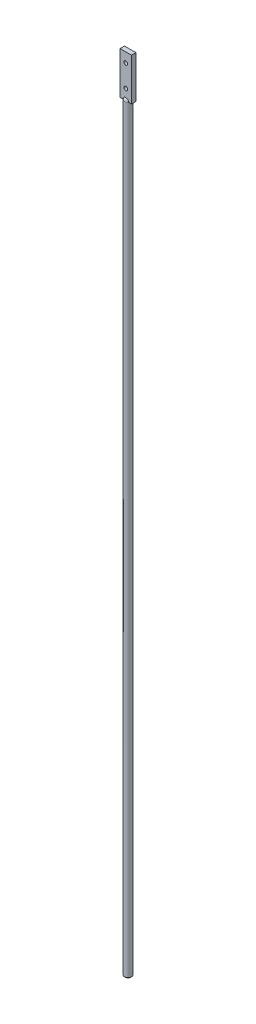
ISO-10303-21;
HEADER;
FILE_DESCRIPTION(('STEP AP214'),'2;1');
FILE_NAME('part.step','',(''),(''),'','','');
FILE_SCHEMA(('AUTOMOTIVE_DESIGN { 1 0 10303 214 1 1 1 1 }'));
ENDSEC;
DATA;
#1=APPLICATION_CONTEXT('core data for automotive mechanical design processes');
#2=APPLICATION_PROTOCOL_DEFINITION('international standard','automotive_design',2000,#1);
#3=PRODUCT_CONTEXT('',#1,'mechanical');
#4=PRODUCT('Part','Part','',(#3));
#5=PRODUCT_RELATED_PRODUCT_CATEGORY('part','',(#4));
#6=PRODUCT_DEFINITION_FORMATION('','',#4);
#7=PRODUCT_DEFINITION_CONTEXT('part definition',#1,'design');
#8=PRODUCT_DEFINITION('design','',#6,#7);
#9=PRODUCT_DEFINITION_SHAPE('','',#8);
#10=(LENGTH_UNIT() NAMED_UNIT(*) SI_UNIT(.MILLI.,.METRE.));
#11=(NAMED_UNIT(*) PLANE_ANGLE_UNIT() SI_UNIT($,.RADIAN.));
#12=(NAMED_UNIT(*) SI_UNIT($,.STERADIAN.) SOLID_ANGLE_UNIT());
#13=UNCERTAINTY_MEASURE_WITH_UNIT(LENGTH_MEASURE(1.E-05),#10,'distance_accuracy_value','');
#14=(GEOMETRIC_REPRESENTATION_CONTEXT(3) GLOBAL_UNCERTAINTY_ASSIGNED_CONTEXT((#13)) GLOBAL_UNIT_ASSIGNED_CONTEXT((#10,
#11,#12)) REPRESENTATION_CONTEXT('',''));
#15=CARTESIAN_POINT('',(0.,0.,0.));
#16=DIRECTION('',(0.,0.,1.));
#17=DIRECTION('',(1.,0.,0.));
#18=AXIS2_PLACEMENT_3D('',#15,#16,#17);
#19=CARTESIAN_POINT('',(0.,13.,2.5));
#20=DIRECTION('',(0.,0.,1.));
#21=DIRECTION('',(1.,0.,0.));
#22=AXIS2_PLACEMENT_3D('',#19,#20,#21);
#23=CYLINDRICAL_SURFACE('',#22,2.1);
#24=CARTESIAN_POINT('',(0.,13.,-2.5));
#25=DIRECTION('',(0.,0.,1.));
#26=DIRECTION('',(1.,0.,0.));
#27=AXIS2_PLACEMENT_3D('',#24,#25,#26);
#28=CIRCLE('',#27,2.1);
#29=CARTESIAN_POINT('',(2.1,13.,-2.5));
#30=VERTEX_POINT('',#29);
#31=EDGE_CURVE('E20',#30,#30,#28,.F.);
#32=ORIENTED_EDGE('',*,*,#31,.T.);
#33=EDGE_LOOP('',(#32));
#34=FACE_BOUND('',#33,.T.);
#35=CARTESIAN_POINT('',(0.,13.,2.5));
#36=DIRECTION('',(0.,0.,1.));
#37=DIRECTION('',(1.,0.,0.));
#38=AXIS2_PLACEMENT_3D('',#35,#36,#37);
#39=CIRCLE('',#38,2.1);
#40=CARTESIAN_POINT('',(2.1,13.,2.5));
#41=VERTEX_POINT('',#40);
#42=EDGE_CURVE('E98',#41,#41,#39,.F.);
#43=ORIENTED_EDGE('',*,*,#42,.F.);
#44=EDGE_LOOP('',(#43));
#45=FACE_BOUND('',#44,.T.);
#46=ADVANCED_FACE('F16',(#34,#45),#23,.F.);
#47=CARTESIAN_POINT('',(0.,-12.,2.5));
#48=DIRECTION('',(0.,0.,1.));
#49=DIRECTION('',(1.,0.,0.));
#50=AXIS2_PLACEMENT_3D('',#47,#48,#49);
#51=CYLINDRICAL_SURFACE('',#50,2.1);
#52=CARTESIAN_POINT('',(0.,-12.,-2.5));
#53=DIRECTION('',(0.,0.,1.));
#54=DIRECTION('',(1.,0.,0.));
#55=AXIS2_PLACEMENT_3D('',#52,#53,#54);
#56=CIRCLE('',#55,2.1);
#57=CARTESIAN_POINT('',(2.1,-12.,-2.5));
#58=VERTEX_POINT('',#57);
#59=EDGE_CURVE('E100',#58,#58,#56,.F.);
#60=ORIENTED_EDGE('',*,*,#59,.T.);
#61=EDGE_LOOP('',(#60));
#62=FACE_BOUND('',#61,.T.);
#63=CARTESIAN_POINT('',(0.,-12.,2.5));
#64=DIRECTION('',(0.,0.,1.));
#65=DIRECTION('',(1.,0.,0.));
#66=AXIS2_PLACEMENT_3D('',#63,#64,#65);
#67=CIRCLE('',#66,2.1);
#68=CARTESIAN_POINT('',(2.1,-12.,2.5));
#69=VERTEX_POINT('',#68);
#70=EDGE_CURVE('E94',#69,#69,#67,.F.);
#71=ORIENTED_EDGE('',*,*,#70,.F.);
#72=EDGE_LOOP('',(#71));
#73=FACE_BOUND('',#72,.T.);
#74=ADVANCED_FACE('F225',(#62,#73),#51,.F.);
#75=CARTESIAN_POINT('',(-6.50000000000001,24.,2.5));
#76=DIRECTION('',(0.,1.,0.));
#77=DIRECTION('',(0.,0.,1.));
#78=AXIS2_PLACEMENT_3D('',#75,#76,#77);
#79=PLANE('',#78);
#80=DIRECTION('',(1.,0.,0.));
#81=VECTOR('',#80,1.);
#82=CARTESIAN_POINT('',(0.,24.,-2.5));
#83=LINE('',#82,#81);
#84=CARTESIAN_POINT('',(6.5,24.,-2.5));
#85=VERTEX_POINT('',#84);
#86=CARTESIAN_POINT('',(-6.50000000000001,24.,-2.5));
#87=VERTEX_POINT('',#86);
#88=EDGE_CURVE('E109',#85,#87,#83,.F.);
#89=ORIENTED_EDGE('',*,*,#88,.T.);
#90=DIRECTION('',(0.,0.,1.));
#91=VECTOR('',#90,1.);
#92=CARTESIAN_POINT('',(-6.50000000000001,24.,2.5));
#93=LINE('',#92,#91);
#94=CARTESIAN_POINT('',(-6.50000000000001,24.,2.5));
#95=VERTEX_POINT('',#94);
#96=EDGE_CURVE('E125',#87,#95,#93,.T.);
#97=ORIENTED_EDGE('',*,*,#96,.T.);
#98=DIRECTION('',(1.,0.,0.));
#99=VECTOR('',#98,1.);
#100=CARTESIAN_POINT('',(0.,24.,2.5));
#101=LINE('',#100,#99);
#102=CARTESIAN_POINT('',(6.5,24.,2.5));
#103=VERTEX_POINT('',#102);
#104=EDGE_CURVE('E79',#103,#95,#101,.F.);
#105=ORIENTED_EDGE('',*,*,#104,.F.);
#106=DIRECTION('',(0.,0.,1.));
#107=VECTOR('',#106,1.);
#108=CARTESIAN_POINT('',(6.5,24.,2.5));
#109=LINE('',#108,#107);
#110=EDGE_CURVE('E122',#85,#103,#109,.T.);
#111=ORIENTED_EDGE('',*,*,#110,.F.);
#112=EDGE_LOOP('',(#89,#97,#105,#111));
#113=FACE_BOUND('',#112,.T.);
#114=ADVANCED_FACE('F141',(#113),#79,.T.);
#115=CARTESIAN_POINT('',(-6.50000000000001,24.,2.5));
#116=DIRECTION('',(1.,0.,0.));
#117=DIRECTION('',(0.,1.,0.));
#118=AXIS2_PLACEMENT_3D('',#115,#116,#117);
#119=PLANE('',#118);
#120=DIRECTION('',(0.,1.,0.));
#121=VECTOR('',#120,1.);
#122=CARTESIAN_POINT('',(-6.50000000000001,0.,2.5));
#123=LINE('',#122,#121);
#124=CARTESIAN_POINT('',(-6.5,-24.,2.5));
#125=VERTEX_POINT('',#124);
#126=EDGE_CURVE('E97',#95,#125,#123,.F.);
#127=ORIENTED_EDGE('',*,*,#126,.F.);
#128=ORIENTED_EDGE('',*,*,#96,.F.);
#129=DIRECTION('',(0.,1.,0.));
#130=VECTOR('',#129,1.);
#131=CARTESIAN_POINT('',(-6.50000000000001,0.,-2.5));
#132=LINE('',#131,#130);
#133=CARTESIAN_POINT('',(-6.5,-24.,-2.5));
#134=VERTEX_POINT('',#133);
#135=EDGE_CURVE('E105',#87,#134,#132,.F.);
#136=ORIENTED_EDGE('',*,*,#135,.T.);
#137=DIRECTION('',(0.,0.,1.));
#138=VECTOR('',#137,1.);
#139=CARTESIAN_POINT('',(-6.5,-24.,2.5));
#140=LINE('',#139,#138);
#141=EDGE_CURVE('E78',#134,#125,#140,.T.);
#142=ORIENTED_EDGE('',*,*,#141,.T.);
#143=EDGE_LOOP('',(#127,#128,#136,#142));
#144=FACE_BOUND('',#143,.T.);
#145=ADVANCED_FACE('F147',(#144),#119,.F.);
#146=CARTESIAN_POINT('',(0.,-884.5,0.));
#147=DIRECTION('',(0.,-1.,0.));
#148=DIRECTION('',(0.,0.,-1.));
#149=AXIS2_PLACEMENT_3D('',#146,#147,#148);
#150=PLANE('',#149);
#151=CARTESIAN_POINT('',(0.,-884.500000000003,0.));
#152=DIRECTION('',(0.,1.,0.));
#153=DIRECTION('',(0.,0.,1.));
#154=AXIS2_PLACEMENT_3D('',#151,#152,#153);
#155=CIRCLE('',#154,2.9999999999859);
#156=CARTESIAN_POINT('',(0.,-884.500000000003,2.9999999999859));
#157=VERTEX_POINT('',#156);
#158=EDGE_CURVE('E70',#157,#157,#155,.T.);
#159=ORIENTED_EDGE('',*,*,#158,.F.);
#160=EDGE_LOOP('',(#159));
#161=FACE_BOUND('',#160,.T.);
#162=ADVANCED_FACE('F217',(#161),#150,.T.);
#163=CARTESIAN_POINT('',(6.5,24.,2.5));
#164=DIRECTION('',(1.,0.,0.));
#165=DIRECTION('',(0.,1.,0.));
#166=AXIS2_PLACEMENT_3D('',#163,#164,#165);
#167=PLANE('',#166);
#168=DIRECTION('',(0.,1.,0.));
#169=VECTOR('',#168,1.);
#170=CARTESIAN_POINT('',(6.5,0.,-2.5));
#171=LINE('',#170,#169);
#172=CARTESIAN_POINT('',(6.5,-24.,-2.5));
#173=VERTEX_POINT('',#172);
#174=EDGE_CURVE('E114',#173,#85,#171,.T.);
#175=ORIENTED_EDGE('',*,*,#174,.T.);
#176=ORIENTED_EDGE('',*,*,#110,.T.);
#177=DIRECTION('',(0.,1.,0.));
#178=VECTOR('',#177,1.);
#179=CARTESIAN_POINT('',(6.5,0.,2.5));
#180=LINE('',#179,#178);
#181=CARTESIAN_POINT('',(6.5,-24.,2.5));
#182=VERTEX_POINT('',#181);
#183=EDGE_CURVE('E130',#182,#103,#180,.T.);
#184=ORIENTED_EDGE('',*,*,#183,.F.);
#185=DIRECTION('',(0.,0.,1.));
#186=VECTOR('',#185,1.);
#187=CARTESIAN_POINT('',(6.5,-24.,2.5));
#188=LINE('',#187,#186);
#189=EDGE_CURVE('E176',#182,#173,#188,.F.);
#190=ORIENTED_EDGE('',*,*,#189,.T.);
#191=EDGE_LOOP('',(#175,#176,#184,#190));
#192=FACE_BOUND('',#191,.T.);
#193=ADVANCED_FACE('F186',(#192),#167,.T.);
#194=CARTESIAN_POINT('',(0.,0.,-2.5));
#195=DIRECTION('',(0.,0.,1.));
#196=DIRECTION('',(1.,0.,0.));
#197=AXIS2_PLACEMENT_3D('',#194,#195,#196);
#198=PLANE('',#197);
#199=ORIENTED_EDGE('',*,*,#59,.F.);
#200=EDGE_LOOP('',(#199));
#201=FACE_BOUND('',#200,.T.);
#202=ORIENTED_EDGE('',*,*,#31,.F.);
#203=EDGE_LOOP('',(#202));
#204=FACE_BOUND('',#203,.T.);
#205=DIRECTION('',(1.,0.,0.));
#206=VECTOR('',#205,1.);
#207=CARTESIAN_POINT('',(-6.5,-24.,-2.5));
#208=LINE('',#207,#206);
#209=CARTESIAN_POINT('',(-3.1224989991992,-24.,-2.5));
#210=VERTEX_POINT('',#209);
#211=EDGE_CURVE('E64',#210,#134,#208,.F.);
#212=ORIENTED_EDGE('',*,*,#211,.T.);
#213=ORIENTED_EDGE('',*,*,#135,.F.);
#214=ORIENTED_EDGE('',*,*,#88,.F.);
#215=ORIENTED_EDGE('',*,*,#174,.F.);
#216=DIRECTION('',(1.,0.,0.));
#217=VECTOR('',#216,1.);
#218=CARTESIAN_POINT('',(-6.5,-24.,-2.5));
#219=LINE('',#218,#217);
#220=CARTESIAN_POINT('',(3.1224989991992,-24.,-2.5));
#221=VERTEX_POINT('',#220);
#222=EDGE_CURVE('E68',#173,#221,#219,.F.);
#223=ORIENTED_EDGE('',*,*,#222,.T.);
#224=CARTESIAN_POINT('',(0.,-24.,-2.5));
#225=DIRECTION('',(0.,0.,1.));
#226=DIRECTION('',(1.,0.,0.));
#227=AXIS2_PLACEMENT_3D('',#224,#225,#226);
#228=CIRCLE('',#227,3.1224989991992);
#229=EDGE_CURVE('E51',#210,#221,#228,.F.);
#230=ORIENTED_EDGE('',*,*,#229,.F.);
#231=EDGE_LOOP('',(#212,#213,#214,#215,#223,#230));
#232=FACE_BOUND('',#231,.T.);
#233=ADVANCED_FACE('F61',(#201,#204,#232),#198,.F.);
#234=CARTESIAN_POINT('',(0.,0.,2.5));
#235=DIRECTION('',(0.,0.,1.));
#236=DIRECTION('',(1.,0.,0.));
#237=AXIS2_PLACEMENT_3D('',#234,#235,#236);
#238=PLANE('',#237);
#239=ORIENTED_EDGE('',*,*,#183,.T.);
#240=ORIENTED_EDGE('',*,*,#104,.T.);
#241=ORIENTED_EDGE('',*,*,#126,.T.);
#242=DIRECTION('',(1.,0.,0.));
#243=VECTOR('',#242,1.);
#244=CARTESIAN_POINT('',(-6.5,-24.,2.5));
#245=LINE('',#244,#243);
#246=CARTESIAN_POINT('',(-3.1224989991992,-24.,2.5));
#247=VERTEX_POINT('',#246);
#248=EDGE_CURVE('E93',#125,#247,#245,.T.);
#249=ORIENTED_EDGE('',*,*,#248,.T.);
#250=CARTESIAN_POINT('',(0.,-24.,2.5));
#251=DIRECTION('',(0.,0.,1.));
#252=DIRECTION('',(1.,0.,0.));
#253=AXIS2_PLACEMENT_3D('',#250,#251,#252);
#254=CIRCLE('',#253,3.1224989991992);
#255=CARTESIAN_POINT('',(3.1224989991992,-24.,2.5));
#256=VERTEX_POINT('',#255);
#257=EDGE_CURVE('E34',#256,#247,#254,.T.);
#258=ORIENTED_EDGE('',*,*,#257,.F.);
#259=DIRECTION('',(1.,0.,0.));
#260=VECTOR('',#259,1.);
#261=CARTESIAN_POINT('',(-6.5,-24.,2.5));
#262=LINE('',#261,#260);
#263=EDGE_CURVE('E69',#256,#182,#262,.T.);
#264=ORIENTED_EDGE('',*,*,#263,.T.);
#265=EDGE_LOOP('',(#239,#240,#241,#249,#258,#264));
#266=FACE_BOUND('',#265,.T.);
#267=ORIENTED_EDGE('',*,*,#70,.T.);
#268=EDGE_LOOP('',(#267));
#269=FACE_BOUND('',#268,.T.);
#270=ORIENTED_EDGE('',*,*,#42,.T.);
#271=EDGE_LOOP('',(#270));
#272=FACE_BOUND('',#271,.T.);
#273=ADVANCED_FACE('F150',(#266,#269,#272),#238,.T.);
#274=CARTESIAN_POINT('',(-6.5,-24.,2.5));
#275=DIRECTION('',(0.,1.,0.));
#276=DIRECTION('',(0.,0.,1.));
#277=AXIS2_PLACEMENT_3D('',#274,#275,#276);
#278=PLANE('',#277);
#279=ORIENTED_EDGE('',*,*,#248,.F.);
#280=ORIENTED_EDGE('',*,*,#141,.F.);
#281=ORIENTED_EDGE('',*,*,#211,.F.);
#282=CARTESIAN_POINT('',(0.,-24.,0.));
#283=DIRECTION('',(0.,1.,0.));
#284=DIRECTION('',(0.,0.,1.));
#285=AXIS2_PLACEMENT_3D('',#282,#283,#284);
#286=CIRCLE('',#285,4.);
#287=EDGE_CURVE('E76',#247,#210,#286,.F.);
#288=ORIENTED_EDGE('',*,*,#287,.F.);
#289=EDGE_LOOP('',(#279,#280,#281,#288));
#290=FACE_BOUND('',#289,.T.);
#291=ADVANCED_FACE('F75',(#290),#278,.F.);
#292=CARTESIAN_POINT('',(0.,-883.50000000014,0.));
#293=DIRECTION('',(0.,1.,0.));
#294=DIRECTION('',(0.,0.,1.));
#295=AXIS2_PLACEMENT_3D('',#292,#293,#294);
#296=CONICAL_SURFACE('',#295,3.99999999984857,0.785398163397448);
#297=CARTESIAN_POINT('',(0.,-883.5,0.));
#298=DIRECTION('',(0.,1.,0.));
#299=DIRECTION('',(0.,0.,1.));
#300=AXIS2_PLACEMENT_3D('',#297,#298,#299);
#301=CIRCLE('',#300,4.);
#302=CARTESIAN_POINT('',(0.,-883.5,4.));
#303=VERTEX_POINT('',#302);
#304=EDGE_CURVE('E56',#303,#303,#301,.T.);
#305=ORIENTED_EDGE('',*,*,#304,.F.);
#306=EDGE_LOOP('',(#305));
#307=FACE_BOUND('',#306,.T.);
#308=ORIENTED_EDGE('',*,*,#158,.T.);
#309=EDGE_LOOP('',(#308));
#310=FACE_BOUND('',#309,.T.);
#311=ADVANCED_FACE('F203',(#307,#310),#296,.T.);
#312=CARTESIAN_POINT('',(0.,-24.,0.));
#313=DIRECTION('',(1.,0.,0.));
#314=DIRECTION('',(0.,0.,-1.));
#315=AXIS2_PLACEMENT_3D('',#312,#313,#314);
#316=SPHERICAL_SURFACE('',#315,4.);
#317=CARTESIAN_POINT('',(0.,-24.,0.));
#318=DIRECTION('',(0.,1.,0.));
#319=DIRECTION('',(0.,0.,1.));
#320=AXIS2_PLACEMENT_3D('',#317,#318,#319);
#321=CIRCLE('',#320,4.);
#322=EDGE_CURVE('E48',#210,#221,#321,.F.);
#323=ORIENTED_EDGE('',*,*,#322,.F.);
#324=ORIENTED_EDGE('',*,*,#229,.T.);
#325=EDGE_LOOP('',(#323,#324));
#326=FACE_BOUND('',#325,.T.);
#327=ADVANCED_FACE('F50',(#326),#316,.T.);
#328=CARTESIAN_POINT('',(-6.5,-24.,2.5));
#329=DIRECTION('',(0.,1.,0.));
#330=DIRECTION('',(0.,0.,1.));
#331=AXIS2_PLACEMENT_3D('',#328,#329,#330);
#332=PLANE('',#331);
#333=ORIENTED_EDGE('',*,*,#222,.F.);
#334=ORIENTED_EDGE('',*,*,#189,.F.);
#335=ORIENTED_EDGE('',*,*,#263,.F.);
#336=CARTESIAN_POINT('',(0.,-24.,0.));
#337=DIRECTION('',(0.,1.,0.));
#338=DIRECTION('',(0.,0.,1.));
#339=AXIS2_PLACEMENT_3D('',#336,#337,#338);
#340=CIRCLE('',#339,4.);
#341=EDGE_CURVE('E26',#221,#256,#340,.F.);
#342=ORIENTED_EDGE('',*,*,#341,.F.);
#343=EDGE_LOOP('',(#333,#334,#335,#342));
#344=FACE_BOUND('',#343,.T.);
#345=ADVANCED_FACE('F190',(#344),#332,.F.);
#346=CARTESIAN_POINT('',(0.,-24.,0.));
#347=DIRECTION('',(1.,0.,0.));
#348=DIRECTION('',(0.,0.785891834052638,0.618363990841463));
#349=AXIS2_PLACEMENT_3D('',#346,#347,#348);
#350=SPHERICAL_SURFACE('',#349,4.);
#351=ORIENTED_EDGE('',*,*,#257,.T.);
#352=CARTESIAN_POINT('',(0.,-24.,0.));
#353=DIRECTION('',(0.,1.,0.));
#354=DIRECTION('',(0.,0.,1.));
#355=AXIS2_PLACEMENT_3D('',#352,#353,#354);
#356=CIRCLE('',#355,4.);
#357=EDGE_CURVE('E11',#256,#247,#356,.F.);
#358=ORIENTED_EDGE('',*,*,#357,.F.);
#359=EDGE_LOOP('',(#351,#358));
#360=FACE_BOUND('',#359,.T.);
#361=ADVANCED_FACE('F18',(#360),#350,.T.);
#362=CARTESIAN_POINT('',(0.,-884.5,0.));
#363=DIRECTION('',(0.,1.,0.));
#364=DIRECTION('',(0.,0.,1.));
#365=AXIS2_PLACEMENT_3D('',#362,#363,#364);
#366=CYLINDRICAL_SURFACE('',#365,4.);
#367=ORIENTED_EDGE('',*,*,#287,.T.);
#368=ORIENTED_EDGE('',*,*,#322,.T.);
#369=ORIENTED_EDGE('',*,*,#341,.T.);
#370=ORIENTED_EDGE('',*,*,#357,.T.);
#371=EDGE_LOOP('',(#367,#368,#369,#370));
#372=FACE_BOUND('',#371,.T.);
#373=ORIENTED_EDGE('',*,*,#304,.T.);
#374=EDGE_LOOP('',(#373));
#375=FACE_BOUND('',#374,.T.);
#376=ADVANCED_FACE('F81',(#372,#375),#366,.T.);
#377=CLOSED_SHELL('',(#46,#74,#114,#145,#162,#193,#233,#273,#291,#311,#327,#345,#361,#376));
#378=MANIFOLD_SOLID_BREP('B1',#377);
#379=ADVANCED_BREP_SHAPE_REPRESENTATION('',(#18,#378),#14);
#380=SHAPE_DEFINITION_REPRESENTATION(#9,#379);
ENDSEC;
END-ISO-10303-21;
